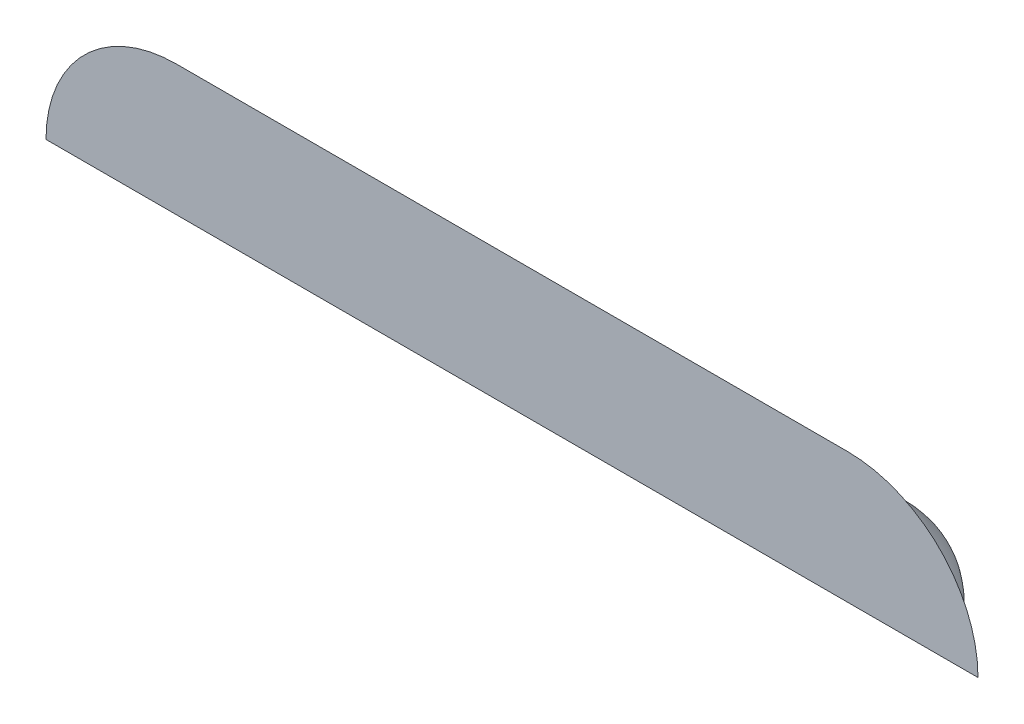
ISO-10303-21;
HEADER;
FILE_DESCRIPTION(('STEP AP214'),'2;1');
FILE_NAME('part.step','',(''),(''),'','','');
FILE_SCHEMA(('AUTOMOTIVE_DESIGN { 1 0 10303 214 1 1 1 1 }'));
ENDSEC;
DATA;
#1=APPLICATION_CONTEXT('core data for automotive mechanical design processes');
#2=APPLICATION_PROTOCOL_DEFINITION('international standard','automotive_design',2000,#1);
#3=PRODUCT_CONTEXT('',#1,'mechanical');
#4=PRODUCT('Part','Part','',(#3));
#5=PRODUCT_RELATED_PRODUCT_CATEGORY('part','',(#4));
#6=PRODUCT_DEFINITION_FORMATION('','',#4);
#7=PRODUCT_DEFINITION_CONTEXT('part definition',#1,'design');
#8=PRODUCT_DEFINITION('design','',#6,#7);
#9=PRODUCT_DEFINITION_SHAPE('','',#8);
#10=(LENGTH_UNIT() NAMED_UNIT(*) SI_UNIT(.MILLI.,.METRE.));
#11=(NAMED_UNIT(*) PLANE_ANGLE_UNIT() SI_UNIT($,.RADIAN.));
#12=(NAMED_UNIT(*) SI_UNIT($,.STERADIAN.) SOLID_ANGLE_UNIT());
#13=UNCERTAINTY_MEASURE_WITH_UNIT(LENGTH_MEASURE(1.E-05),#10,'distance_accuracy_value','');
#14=(GEOMETRIC_REPRESENTATION_CONTEXT(3) GLOBAL_UNCERTAINTY_ASSIGNED_CONTEXT((#13)) GLOBAL_UNIT_ASSIGNED_CONTEXT((#10,
#11,#12)) REPRESENTATION_CONTEXT('',''));
#15=CARTESIAN_POINT('',(0.,0.,0.));
#16=DIRECTION('',(0.,0.,1.));
#17=DIRECTION('',(1.,0.,0.));
#18=AXIS2_PLACEMENT_3D('',#15,#16,#17);
#19=CARTESIAN_POINT('',(-49.578313253012,0.,0.));
#20=DIRECTION('',(-1.,0.,0.));
#21=DIRECTION('',(0.,-1.,0.));
#22=AXIS2_PLACEMENT_3D('',#19,#20,#21);
#23=CYLINDRICAL_SURFACE('',#22,8.);
#24=CARTESIAN_POINT('',(-114.578313253012,0.,0.));
#25=DIRECTION('',(-1.,0.,0.));
#26=DIRECTION('',(0.,1.,0.));
#27=AXIS2_PLACEMENT_3D('',#24,#25,#26);
#28=CIRCLE('',#27,8.);
#29=CARTESIAN_POINT('',(-114.578313253012,7.22806322324199,-3.42857142857143));
#30=VERTEX_POINT('',#29);
#31=CARTESIAN_POINT('',(-114.578313253012,0.,-8.));
#32=VERTEX_POINT('',#31);
#33=EDGE_CURVE('E130',#30,#32,#28,.T.);
#34=ORIENTED_EDGE('',*,*,#33,.F.);
#35=DIRECTION('',(-1.,0.,0.));
#36=VECTOR('',#35,1.);
#37=CARTESIAN_POINT('',(-49.578313253012,7.228063223242,-3.42857142857143));
#38=LINE('',#37,#36);
#39=CARTESIAN_POINT('',(-49.578313253012,7.228063223242,-3.42857142857143));
#40=VERTEX_POINT('',#39);
#41=EDGE_CURVE('E118',#30,#40,#38,.F.);
#42=ORIENTED_EDGE('',*,*,#41,.T.);
#43=CARTESIAN_POINT('',(-49.578313253012,0.,0.));
#44=DIRECTION('',(-1.,0.,0.));
#45=DIRECTION('',(0.,1.,0.));
#46=AXIS2_PLACEMENT_3D('',#43,#44,#45);
#47=CIRCLE('',#46,8.);
#48=CARTESIAN_POINT('',(-49.578313253012,0.,-8.));
#49=VERTEX_POINT('',#48);
#50=EDGE_CURVE('E133',#40,#49,#47,.T.);
#51=ORIENTED_EDGE('',*,*,#50,.T.);
#52=DIRECTION('',(-1.,0.,0.));
#53=VECTOR('',#52,1.);
#54=CARTESIAN_POINT('',(-49.578313253012,0.,-8.));
#55=LINE('',#54,#53);
#56=EDGE_CURVE('E112',#49,#32,#55,.T.);
#57=ORIENTED_EDGE('',*,*,#56,.T.);
#58=EDGE_LOOP('',(#34,#42,#51,#57));
#59=FACE_BOUND('',#58,.T.);
#60=ADVANCED_FACE('F40',(#59),#23,.T.);
#61=CARTESIAN_POINT('',(-49.578313253012,0.,0.));
#62=DIRECTION('',(0.,-1.,0.));
#63=DIRECTION('',(1.,0.,0.));
#64=AXIS2_PLACEMENT_3D('',#61,#62,#63);
#65=PLANE('',#64);
#66=DIRECTION('',(-1.,0.,0.));
#67=VECTOR('',#66,1.);
#68=CARTESIAN_POINT('',(-49.578313253012,0.,0.));
#69=LINE('',#68,#67);
#70=CARTESIAN_POINT('',(-36.9292026123385,0.,0.));
#71=VERTEX_POINT('',#70);
#72=CARTESIAN_POINT('',(-127.227423893686,0.,0.));
#73=VERTEX_POINT('',#72);
#74=EDGE_CURVE('E94',#71,#73,#69,.T.);
#75=ORIENTED_EDGE('',*,*,#74,.T.);
#76=CARTESIAN_POINT('',(-127.227423893686,0.,-6.));
#77=DIRECTION('',(0.,-1.,0.));
#78=DIRECTION('',(1.,0.,0.));
#79=AXIS2_PLACEMENT_3D('',#76,#77,#78);
#80=CIRCLE('',#79,6.);
#81=CARTESIAN_POINT('',(-121.806376476254,0.,-3.42857142857143));
#82=VERTEX_POINT('',#81);
#83=EDGE_CURVE('E12',#73,#82,#80,.F.);
#84=ORIENTED_EDGE('',*,*,#83,.T.);
#85=CARTESIAN_POINT('',(-114.578313253012,0.,0.));
#86=DIRECTION('',(0.,-1.,0.));
#87=DIRECTION('',(1.,0.,0.));
#88=AXIS2_PLACEMENT_3D('',#85,#86,#87);
#89=CIRCLE('',#88,8.);
#90=EDGE_CURVE('E128',#82,#32,#89,.T.);
#91=ORIENTED_EDGE('',*,*,#90,.T.);
#92=ORIENTED_EDGE('',*,*,#56,.F.);
#93=CARTESIAN_POINT('',(-49.578313253012,0.,0.));
#94=DIRECTION('',(0.,-1.,0.));
#95=DIRECTION('',(1.,0.,0.));
#96=AXIS2_PLACEMENT_3D('',#93,#94,#95);
#97=CIRCLE('',#96,8.);
#98=CARTESIAN_POINT('',(-42.35025002977,0.,-3.42857142857143));
#99=VERTEX_POINT('',#98);
#100=EDGE_CURVE('E124',#49,#99,#97,.T.);
#101=ORIENTED_EDGE('',*,*,#100,.T.);
#102=CARTESIAN_POINT('',(-36.9292026123385,0.,-6.));
#103=DIRECTION('',(0.,-1.,0.));
#104=DIRECTION('',(1.,0.,0.));
#105=AXIS2_PLACEMENT_3D('',#102,#103,#104);
#106=CIRCLE('',#105,6.);
#107=EDGE_CURVE('E49',#99,#71,#106,.F.);
#108=ORIENTED_EDGE('',*,*,#107,.T.);
#109=EDGE_LOOP('',(#75,#84,#91,#92,#101,#108));
#110=FACE_BOUND('',#109,.T.);
#111=ADVANCED_FACE('F121',(#110),#65,.T.);
#112=CARTESIAN_POINT('',(-114.578313253012,0.,0.));
#113=DIRECTION('',(0.,0.,-1.));
#114=DIRECTION('',(-1.,0.,0.));
#115=AXIS2_PLACEMENT_3D('',#112,#113,#114);
#116=SPHERICAL_SURFACE('',#115,8.);
#117=ORIENTED_EDGE('',*,*,#90,.F.);
#118=CARTESIAN_POINT('',(-114.578313253012,0.,-3.42857142857143));
#119=DIRECTION('',(0.,0.,1.));
#120=DIRECTION('',(1.,0.,0.));
#121=AXIS2_PLACEMENT_3D('',#118,#119,#120);
#122=CIRCLE('',#121,7.22806322324201);
#123=EDGE_CURVE('E62',#82,#30,#122,.F.);
#124=ORIENTED_EDGE('',*,*,#123,.T.);
#125=ORIENTED_EDGE('',*,*,#33,.T.);
#126=EDGE_LOOP('',(#117,#124,#125));
#127=FACE_BOUND('',#126,.T.);
#128=ADVANCED_FACE('F135',(#127),#116,.T.);
#129=CARTESIAN_POINT('',(-49.578313253012,0.,0.));
#130=DIRECTION('',(0.,0.,1.));
#131=DIRECTION('',(-1.,0.,0.));
#132=AXIS2_PLACEMENT_3D('',#129,#130,#131);
#133=SPHERICAL_SURFACE('',#132,8.);
#134=ORIENTED_EDGE('',*,*,#50,.F.);
#135=CARTESIAN_POINT('',(-49.578313253012,0.,-3.42857142857143));
#136=DIRECTION('',(0.,0.,1.));
#137=DIRECTION('',(1.,0.,0.));
#138=AXIS2_PLACEMENT_3D('',#135,#136,#137);
#139=CIRCLE('',#138,7.22806322324201);
#140=EDGE_CURVE('E98',#40,#99,#139,.F.);
#141=ORIENTED_EDGE('',*,*,#140,.T.);
#142=ORIENTED_EDGE('',*,*,#100,.F.);
#143=EDGE_LOOP('',(#134,#141,#142));
#144=FACE_BOUND('',#143,.T.);
#145=ADVANCED_FACE('F137',(#144),#133,.T.);
#146=CARTESIAN_POINT('',(-114.578313253012,0.,-6.));
#147=DIRECTION('',(0.,0.,1.));
#148=DIRECTION('',(1.,0.,0.));
#149=AXIS2_PLACEMENT_3D('',#146,#147,#148);
#150=TOROIDAL_SURFACE('',#149,12.6491106406735,6.);
#151=ORIENTED_EDGE('',*,*,#83,.F.);
#152=CARTESIAN_POINT('',(-114.578313253012,0.,0.));
#153=DIRECTION('',(0.,0.,1.));
#154=DIRECTION('',(1.,0.,0.));
#155=AXIS2_PLACEMENT_3D('',#152,#153,#154);
#156=CIRCLE('',#155,12.6491106406735);
#157=CARTESIAN_POINT('',(-114.578313253012,12.6491106406735,0.));
#158=VERTEX_POINT('',#157);
#159=EDGE_CURVE('E99',#158,#73,#156,.T.);
#160=ORIENTED_EDGE('',*,*,#159,.F.);
#161=CARTESIAN_POINT('',(-114.578313253012,12.6491106406735,-6.));
#162=DIRECTION('',(-1.,0.,0.));
#163=DIRECTION('',(0.,-1.,0.));
#164=AXIS2_PLACEMENT_3D('',#161,#162,#163);
#165=CIRCLE('',#164,6.);
#166=EDGE_CURVE('E44',#30,#158,#165,.T.);
#167=ORIENTED_EDGE('',*,*,#166,.F.);
#168=ORIENTED_EDGE('',*,*,#123,.F.);
#169=EDGE_LOOP('',(#151,#160,#167,#168));
#170=FACE_BOUND('',#169,.T.);
#171=ADVANCED_FACE('F42',(#170),#150,.F.);
#172=CARTESIAN_POINT('',(-49.578313253012,12.6491106406735,-6.));
#173=DIRECTION('',(-1.,0.,0.));
#174=DIRECTION('',(0.,-1.,0.));
#175=AXIS2_PLACEMENT_3D('',#172,#173,#174);
#176=CYLINDRICAL_SURFACE('',#175,6.);
#177=ORIENTED_EDGE('',*,*,#166,.T.);
#178=DIRECTION('',(-1.,0.,0.));
#179=VECTOR('',#178,1.);
#180=CARTESIAN_POINT('',(0.,12.6491106406735,0.));
#181=LINE('',#180,#179);
#182=CARTESIAN_POINT('',(-49.578313253012,12.6491106406735,0.));
#183=VERTEX_POINT('',#182);
#184=EDGE_CURVE('E92',#183,#158,#181,.T.);
#185=ORIENTED_EDGE('',*,*,#184,.F.);
#186=CARTESIAN_POINT('',(-49.578313253012,12.6491106406735,-6.));
#187=DIRECTION('',(-1.,0.,0.));
#188=DIRECTION('',(0.,0.,1.));
#189=AXIS2_PLACEMENT_3D('',#186,#187,#188);
#190=CIRCLE('',#189,6.);
#191=EDGE_CURVE('E103',#40,#183,#190,.T.);
#192=ORIENTED_EDGE('',*,*,#191,.F.);
#193=ORIENTED_EDGE('',*,*,#41,.F.);
#194=EDGE_LOOP('',(#177,#185,#192,#193));
#195=FACE_BOUND('',#194,.T.);
#196=ADVANCED_FACE('F108',(#195),#176,.F.);
#197=CARTESIAN_POINT('',(-49.578313253012,0.,-6.));
#198=DIRECTION('',(0.,0.,1.));
#199=DIRECTION('',(1.,0.,0.));
#200=AXIS2_PLACEMENT_3D('',#197,#198,#199);
#201=TOROIDAL_SURFACE('',#200,12.6491106406735,6.);
#202=ORIENTED_EDGE('',*,*,#107,.F.);
#203=ORIENTED_EDGE('',*,*,#140,.F.);
#204=ORIENTED_EDGE('',*,*,#191,.T.);
#205=CARTESIAN_POINT('',(-49.578313253012,0.,0.));
#206=DIRECTION('',(0.,0.,1.));
#207=DIRECTION('',(1.,0.,0.));
#208=AXIS2_PLACEMENT_3D('',#205,#206,#207);
#209=CIRCLE('',#208,12.6491106406735);
#210=EDGE_CURVE('E88',#71,#183,#209,.T.);
#211=ORIENTED_EDGE('',*,*,#210,.F.);
#212=EDGE_LOOP('',(#202,#203,#204,#211));
#213=FACE_BOUND('',#212,.T.);
#214=ADVANCED_FACE('F104',(#213),#201,.F.);
#215=CARTESIAN_POINT('',(-144.578313253012,74.5481927710843,0.));
#216=DIRECTION('',(0.,0.,-1.));
#217=DIRECTION('',(-1.,0.,0.));
#218=AXIS2_PLACEMENT_3D('',#215,#216,#217);
#219=PLANE('',#218);
#220=ORIENTED_EDGE('',*,*,#74,.F.);
#221=ORIENTED_EDGE('',*,*,#210,.T.);
#222=ORIENTED_EDGE('',*,*,#184,.T.);
#223=ORIENTED_EDGE('',*,*,#159,.T.);
#224=EDGE_LOOP('',(#220,#221,#222,#223));
#225=FACE_BOUND('',#224,.T.);
#226=ADVANCED_FACE('F90',(#225),#219,.F.);
#227=CLOSED_SHELL('',(#60,#111,#128,#145,#171,#196,#214,#226));
#228=MANIFOLD_SOLID_BREP('B2',#227);
#229=ADVANCED_BREP_SHAPE_REPRESENTATION('',(#18,#228),#14);
#230=SHAPE_DEFINITION_REPRESENTATION(#9,#229);
ENDSEC;
END-ISO-10303-21;
